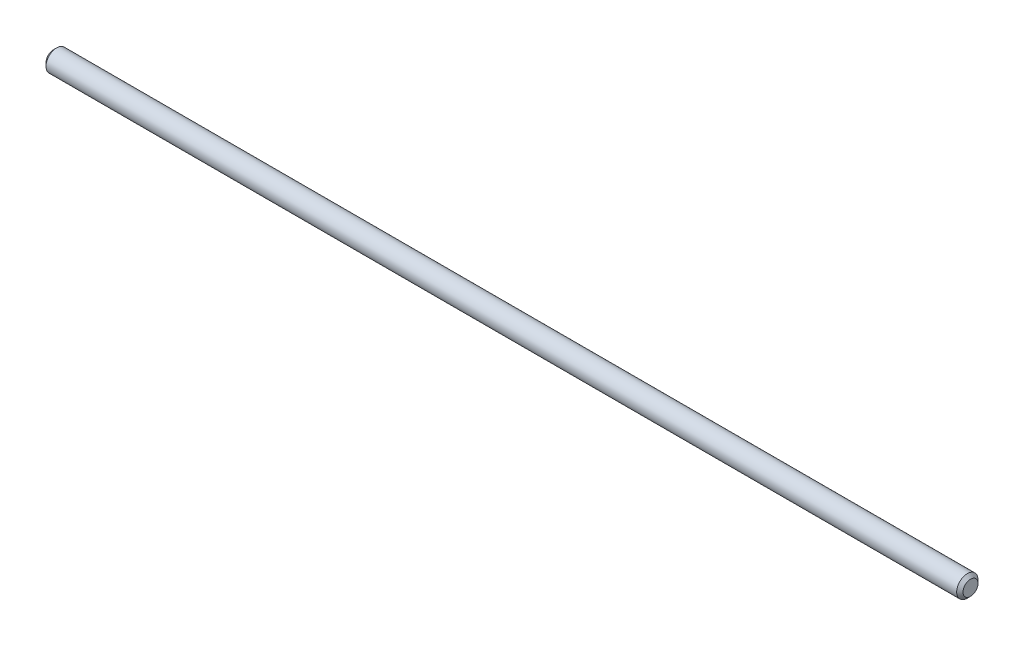
ISO-10303-21;
HEADER;
FILE_DESCRIPTION(('STEP AP214'),'2;1');
FILE_NAME('part.step','',(''),(''),'','','');
FILE_SCHEMA(('AUTOMOTIVE_DESIGN { 1 0 10303 214 1 1 1 1 }'));
ENDSEC;
DATA;
#1=APPLICATION_CONTEXT('core data for automotive mechanical design processes');
#2=APPLICATION_PROTOCOL_DEFINITION('international standard','automotive_design',2000,#1);
#3=PRODUCT_CONTEXT('',#1,'mechanical');
#4=PRODUCT('Part','Part','',(#3));
#5=PRODUCT_RELATED_PRODUCT_CATEGORY('part','',(#4));
#6=PRODUCT_DEFINITION_FORMATION('','',#4);
#7=PRODUCT_DEFINITION_CONTEXT('part definition',#1,'design');
#8=PRODUCT_DEFINITION('design','',#6,#7);
#9=PRODUCT_DEFINITION_SHAPE('','',#8);
#10=(LENGTH_UNIT() NAMED_UNIT(*) SI_UNIT(.MILLI.,.METRE.));
#11=(NAMED_UNIT(*) PLANE_ANGLE_UNIT() SI_UNIT($,.RADIAN.));
#12=(NAMED_UNIT(*) SI_UNIT($,.STERADIAN.) SOLID_ANGLE_UNIT());
#13=UNCERTAINTY_MEASURE_WITH_UNIT(LENGTH_MEASURE(1.E-05),#10,'distance_accuracy_value','');
#14=(GEOMETRIC_REPRESENTATION_CONTEXT(3) GLOBAL_UNCERTAINTY_ASSIGNED_CONTEXT((#13)) GLOBAL_UNIT_ASSIGNED_CONTEXT((#10,
#11,#12)) REPRESENTATION_CONTEXT('',''));
#15=CARTESIAN_POINT('',(0.,0.,0.));
#16=DIRECTION('',(0.,0.,1.));
#17=DIRECTION('',(1.,0.,0.));
#18=AXIS2_PLACEMENT_3D('',#15,#16,#17);
#19=CARTESIAN_POINT('',(-136.525,0.,0.));
#20=DIRECTION('',(1.,0.,0.));
#21=DIRECTION('',(0.,0.,-1.));
#22=AXIS2_PLACEMENT_3D('',#19,#20,#21);
#23=CYLINDRICAL_SURFACE('',#22,3.17499999999995);
#24=CARTESIAN_POINT('',(-135.5725,0.,0.));
#25=DIRECTION('',(1.,0.,0.));
#26=DIRECTION('',(0.,0.,-1.));
#27=AXIS2_PLACEMENT_3D('',#24,#25,#26);
#28=CIRCLE('',#27,3.17499999999995);
#29=CARTESIAN_POINT('',(-135.5725,0.,-3.17499999999995));
#30=VERTEX_POINT('',#29);
#31=EDGE_CURVE('E49',#30,#30,#28,.T.);
#32=CARTESIAN_POINT('',(135.5725,0.,0.));
#33=DIRECTION('',(1.,0.,0.));
#34=DIRECTION('',(0.,0.,-1.));
#35=AXIS2_PLACEMENT_3D('',#32,#33,#34);
#36=CIRCLE('',#35,3.17499999999995);
#37=CARTESIAN_POINT('',(135.5725,0.,-3.17499999999995));
#38=VERTEX_POINT('',#37);
#39=EDGE_CURVE('E53',#38,#38,#36,.F.);
#40=CARTESIAN_POINT('',(-135.5725,0.,-3.17499999999995));
#41=CARTESIAN_POINT('',(-132.748072916667,0.,-3.17499999999995));
#42=CARTESIAN_POINT('',(-129.923645833333,0.,-3.17499999999995));
#43=CARTESIAN_POINT('',(-124.274791666667,0.,-3.17499999999995));
#44=CARTESIAN_POINT('',(-121.450364583333,0.,-3.17499999999995));
#45=CARTESIAN_POINT('',(-115.801510416667,0.,-3.17499999999995));
#46=CARTESIAN_POINT('',(-112.977083333333,0.,-3.17499999999995));
#47=CARTESIAN_POINT('',(-107.328229166667,0.,-3.17499999999995));
#48=CARTESIAN_POINT('',(-104.503802083333,0.,-3.17499999999995));
#49=CARTESIAN_POINT('',(-98.8549479166667,0.,-3.17499999999995));
#50=CARTESIAN_POINT('',(-96.0305208333333,0.,-3.17499999999995));
#51=CARTESIAN_POINT('',(-90.3816666666667,0.,-3.17499999999995));
#52=CARTESIAN_POINT('',(-87.5572395833333,0.,-3.17499999999995));
#53=CARTESIAN_POINT('',(-81.9083854166667,0.,-3.17499999999995));
#54=CARTESIAN_POINT('',(-79.0839583333333,0.,-3.17499999999995));
#55=CARTESIAN_POINT('',(-73.4351041666667,0.,-3.17499999999995));
#56=CARTESIAN_POINT('',(-70.6106770833333,0.,-3.17499999999995));
#57=CARTESIAN_POINT('',(-64.9618229166667,0.,-3.17499999999995));
#58=CARTESIAN_POINT('',(-62.1373958333333,0.,-3.17499999999995));
#59=CARTESIAN_POINT('',(-56.4885416666667,0.,-3.17499999999995));
#60=CARTESIAN_POINT('',(-53.6641145833333,0.,-3.17499999999995));
#61=CARTESIAN_POINT('',(-48.0152604166667,0.,-3.17499999999995));
#62=CARTESIAN_POINT('',(-45.1908333333333,0.,-3.17499999999995));
#63=CARTESIAN_POINT('',(-39.5419791666667,0.,-3.17499999999995));
#64=CARTESIAN_POINT('',(-36.7175520833333,0.,-3.17499999999995));
#65=CARTESIAN_POINT('',(-31.0686979166667,0.,-3.17499999999995));
#66=CARTESIAN_POINT('',(-28.2442708333333,0.,-3.17499999999995));
#67=CARTESIAN_POINT('',(-22.5954166666667,0.,-3.17499999999995));
#68=CARTESIAN_POINT('',(-19.7709895833333,0.,-3.17499999999995));
#69=CARTESIAN_POINT('',(-14.1221354166667,0.,-3.17499999999995));
#70=CARTESIAN_POINT('',(-11.2977083333334,0.,-3.17499999999995));
#71=CARTESIAN_POINT('',(-5.64885416666668,0.,-3.17499999999995));
#72=CARTESIAN_POINT('',(-2.82442708333334,0.,-3.17499999999995));
#73=CARTESIAN_POINT('',(2.82442708333332,0.,-3.17499999999995));
#74=CARTESIAN_POINT('',(5.64885416666664,0.,-3.17499999999995));
#75=CARTESIAN_POINT('',(11.2977083333333,0.,-3.17499999999995));
#76=CARTESIAN_POINT('',(14.1221354166666,0.,-3.17499999999995));
#77=CARTESIAN_POINT('',(19.7709895833333,0.,-3.17499999999995));
#78=CARTESIAN_POINT('',(22.5954166666667,0.,-3.17499999999995));
#79=CARTESIAN_POINT('',(28.2442708333333,0.,-3.17499999999995));
#80=CARTESIAN_POINT('',(31.0686979166666,0.,-3.17499999999995));
#81=CARTESIAN_POINT('',(36.7175520833333,0.,-3.17499999999995));
#82=CARTESIAN_POINT('',(39.5419791666666,0.,-3.17499999999995));
#83=CARTESIAN_POINT('',(45.1908333333333,0.,-3.17499999999995));
#84=CARTESIAN_POINT('',(48.0152604166667,0.,-3.17499999999995));
#85=CARTESIAN_POINT('',(53.6641145833333,0.,-3.17499999999995));
#86=CARTESIAN_POINT('',(56.4885416666666,0.,-3.17499999999995));
#87=CARTESIAN_POINT('',(62.1373958333333,0.,-3.17499999999995));
#88=CARTESIAN_POINT('',(64.9618229166666,0.,-3.17499999999995));
#89=CARTESIAN_POINT('',(70.6106770833333,0.,-3.17499999999995));
#90=CARTESIAN_POINT('',(73.4351041666666,0.,-3.17499999999995));
#91=CARTESIAN_POINT('',(79.0839583333333,0.,-3.17499999999995));
#92=CARTESIAN_POINT('',(81.9083854166666,0.,-3.17499999999995));
#93=CARTESIAN_POINT('',(87.5572395833333,0.,-3.17499999999995));
#94=CARTESIAN_POINT('',(90.3816666666666,0.,-3.17499999999995));
#95=CARTESIAN_POINT('',(96.0305208333333,0.,-3.17499999999995));
#96=CARTESIAN_POINT('',(98.8549479166666,0.,-3.17499999999995));
#97=CARTESIAN_POINT('',(104.503802083333,0.,-3.17499999999995));
#98=CARTESIAN_POINT('',(107.328229166667,0.,-3.17499999999995));
#99=CARTESIAN_POINT('',(112.977083333333,0.,-3.17499999999995));
#100=CARTESIAN_POINT('',(115.801510416667,0.,-3.17499999999995));
#101=CARTESIAN_POINT('',(121.450364583333,0.,-3.17499999999995));
#102=CARTESIAN_POINT('',(124.274791666667,0.,-3.17499999999995));
#103=CARTESIAN_POINT('',(129.923645833333,0.,-3.17499999999995));
#104=CARTESIAN_POINT('',(132.748072916667,0.,-3.17499999999995));
#105=CARTESIAN_POINT('',(135.5725,0.,-3.17499999999995));
#106=B_SPLINE_CURVE_WITH_KNOTS('',3,(#40,#41,#42,#43,#44,#45,#46,#47,#48,#49,#50,#51,#52,#53,
#54,#55,#56,#57,#58,#59,#60,#61,#62,#63,#64,#65,#66,#67,#68,#69,#70,#71,#72,#73,#74,#75,#76,#77,
#78,#79,#80,#81,#82,#83,#84,#85,#86,#87,#88,#89,#90,#91,#92,#93,#94,#95,#96,#97,#98,#99,#100,
#101,#102,#103,#104,#105),.UNSPECIFIED.,.F.,.F.,(4,2,2,2,2,2,2,2,2,2,2,2,2,2,2,2,2,2,2,2,2,2,2,
2,2,2,2,2,2,2,2,2,4),(0.,8.47328124999999,16.9465625,25.41984375,33.893125,42.36640625,
50.8396875,59.31296875,67.78625,76.25953125,84.7328125,93.20609375,101.679375,110.15265625,
118.6259375,127.09921875,135.5725,144.04578125,152.5190625,160.99234375,169.465625,177.93890625,
186.4121875,194.88546875,203.35875,211.83203125,220.3053125,228.77859375,237.251875,
245.72515625,254.1984375,262.67171875,271.145),.UNSPECIFIED.);
#107=EDGE_CURVE('BSEAM38',#30,#38,#106,.T.);
#108=ORIENTED_EDGE('',*,*,#31,.T.);
#109=ORIENTED_EDGE('',*,*,#39,.T.);
#110=ORIENTED_EDGE('',*,*,#107,.T.);
#111=ORIENTED_EDGE('',*,*,#107,.F.);
#112=EDGE_LOOP('',(#108,#110,#109,#111));
#113=FACE_BOUND('',#112,.T.);
#114=ADVANCED_FACE('F38',(#113),#23,.T.);
#115=CARTESIAN_POINT('',(-136.525,0.,0.));
#116=DIRECTION('',(1.,0.,0.));
#117=DIRECTION('',(0.,0.,-1.));
#118=AXIS2_PLACEMENT_3D('',#115,#116,#117);
#119=PLANE('',#118);
#120=CARTESIAN_POINT('',(-136.525,0.,0.));
#121=DIRECTION('',(1.,0.,0.));
#122=DIRECTION('',(0.,0.,-1.));
#123=AXIS2_PLACEMENT_3D('',#120,#121,#122);
#124=CIRCLE('',#123,2.22249999999993);
#125=CARTESIAN_POINT('',(-136.525,0.,-2.22249999999992));
#126=VERTEX_POINT('',#125);
#127=EDGE_CURVE('E45',#126,#126,#124,.F.);
#128=ORIENTED_EDGE('',*,*,#127,.T.);
#129=EDGE_LOOP('',(#128));
#130=FACE_BOUND('',#129,.T.);
#131=ADVANCED_FACE('F69',(#130),#119,.F.);
#132=CARTESIAN_POINT('',(136.525,0.,0.));
#133=DIRECTION('',(1.,0.,0.));
#134=DIRECTION('',(0.,0.,-1.));
#135=AXIS2_PLACEMENT_3D('',#132,#133,#134);
#136=PLANE('',#135);
#137=CARTESIAN_POINT('',(136.525,0.,0.));
#138=DIRECTION('',(1.,0.,0.));
#139=DIRECTION('',(0.,0.,-1.));
#140=AXIS2_PLACEMENT_3D('',#137,#138,#139);
#141=CIRCLE('',#140,2.22249999999996);
#142=CARTESIAN_POINT('',(136.525,0.,-2.22249999999996));
#143=VERTEX_POINT('',#142);
#144=EDGE_CURVE('E10',#143,#143,#141,.T.);
#145=ORIENTED_EDGE('',*,*,#144,.T.);
#146=EDGE_LOOP('',(#145));
#147=FACE_BOUND('',#146,.T.);
#148=ADVANCED_FACE('F66',(#147),#136,.T.);
#149=CARTESIAN_POINT('',(-135.5725,0.,0.));
#150=DIRECTION('',(1.,0.,0.));
#151=DIRECTION('',(0.,0.,-1.));
#152=AXIS2_PLACEMENT_3D('',#149,#150,#151);
#153=CONICAL_SURFACE('',#152,3.17499999999995,0.785398163397447);
#154=CARTESIAN_POINT('',(-136.525,0.,-2.22249999999992));
#155=CARTESIAN_POINT('',(-136.515078125,0.,-2.23242187499992));
#156=CARTESIAN_POINT('',(-136.50515625,0.,-2.24234374999992));
#157=CARTESIAN_POINT('',(-136.4853125,0.,-2.26218749999992));
#158=CARTESIAN_POINT('',(-136.475390625,0.,-2.27210937499992));
#159=CARTESIAN_POINT('',(-136.455546875,0.,-2.29195312499992));
#160=CARTESIAN_POINT('',(-136.445625,0.,-2.30187499999992));
#161=CARTESIAN_POINT('',(-136.42578125,0.,-2.32171874999992));
#162=CARTESIAN_POINT('',(-136.415859375,0.,-2.33164062499992));
#163=CARTESIAN_POINT('',(-136.396015625,0.,-2.35148437499992));
#164=CARTESIAN_POINT('',(-136.38609375,0.,-2.36140624999992));
#165=CARTESIAN_POINT('',(-136.36625,0.,-2.38124999999992));
#166=CARTESIAN_POINT('',(-136.356328125,0.,-2.39117187499992));
#167=CARTESIAN_POINT('',(-136.336484375,0.,-2.41101562499992));
#168=CARTESIAN_POINT('',(-136.3265625,0.,-2.42093749999992));
#169=CARTESIAN_POINT('',(-136.30671875,0.,-2.44078124999992));
#170=CARTESIAN_POINT('',(-136.296796875,0.,-2.45070312499992));
#171=CARTESIAN_POINT('',(-136.276953125,0.,-2.47054687499993));
#172=CARTESIAN_POINT('',(-136.26703125,0.,-2.48046874999993));
#173=CARTESIAN_POINT('',(-136.2471875,0.,-2.50031249999992));
#174=CARTESIAN_POINT('',(-136.237265625,0.,-2.51023437499992));
#175=CARTESIAN_POINT('',(-136.217421875,0.,-2.53007812499992));
#176=CARTESIAN_POINT('',(-136.2075,0.,-2.53999999999993));
#177=CARTESIAN_POINT('',(-136.18765625,0.,-2.55984374999993));
#178=CARTESIAN_POINT('',(-136.177734375,0.,-2.56976562499993));
#179=CARTESIAN_POINT('',(-136.157890625,0.,-2.58960937499993));
#180=CARTESIAN_POINT('',(-136.14796875,0.,-2.59953124999992));
#181=CARTESIAN_POINT('',(-136.128125,0.,-2.61937499999993));
#182=CARTESIAN_POINT('',(-136.118203125,0.,-2.62929687499993));
#183=CARTESIAN_POINT('',(-136.098359375,0.,-2.64914062499993));
#184=CARTESIAN_POINT('',(-136.0884375,0.,-2.65906249999993));
#185=CARTESIAN_POINT('',(-136.06859375,0.,-2.67890624999993));
#186=CARTESIAN_POINT('',(-136.058671875,0.,-2.68882812499993));
#187=CARTESIAN_POINT('',(-136.038828125,0.,-2.70867187499993));
#188=CARTESIAN_POINT('',(-136.02890625,0.,-2.71859374999993));
#189=CARTESIAN_POINT('',(-136.0090625,0.,-2.73843749999993));
#190=CARTESIAN_POINT('',(-135.999140625,0.,-2.74835937499993));
#191=CARTESIAN_POINT('',(-135.979296875,0.,-2.76820312499993));
#192=CARTESIAN_POINT('',(-135.969375,0.,-2.77812499999993));
#193=CARTESIAN_POINT('',(-135.94953125,0.,-2.79796874999993));
#194=CARTESIAN_POINT('',(-135.939609375,0.,-2.80789062499993));
#195=CARTESIAN_POINT('',(-135.919765625,0.,-2.82773437499993));
#196=CARTESIAN_POINT('',(-135.90984375,0.,-2.83765624999993));
#197=CARTESIAN_POINT('',(-135.89,0.,-2.85749999999993));
#198=CARTESIAN_POINT('',(-135.880078125,0.,-2.86742187499993));
#199=CARTESIAN_POINT('',(-135.860234375,0.,-2.88726562499994));
#200=CARTESIAN_POINT('',(-135.8503125,0.,-2.89718749999993));
#201=CARTESIAN_POINT('',(-135.83046875,0.,-2.91703124999993));
#202=CARTESIAN_POINT('',(-135.820546875,0.,-2.92695312499993));
#203=CARTESIAN_POINT('',(-135.800703125,0.,-2.94679687499993));
#204=CARTESIAN_POINT('',(-135.79078125,0.,-2.95671874999994));
#205=CARTESIAN_POINT('',(-135.7709375,0.,-2.97656249999994));
#206=CARTESIAN_POINT('',(-135.761015625,0.,-2.98648437499993));
#207=CARTESIAN_POINT('',(-135.741171875,0.,-3.00632812499993));
#208=CARTESIAN_POINT('',(-135.73125,0.,-3.01624999999994));
#209=CARTESIAN_POINT('',(-135.71140625,0.,-3.03609374999994));
#210=CARTESIAN_POINT('',(-135.701484375,0.,-3.04601562499994));
#211=CARTESIAN_POINT('',(-135.681640625,0.,-3.06585937499994));
#212=CARTESIAN_POINT('',(-135.67171875,0.,-3.07578124999993));
#213=CARTESIAN_POINT('',(-135.651875,0.,-3.09562499999994));
#214=CARTESIAN_POINT('',(-135.641953125,0.,-3.10554687499994));
#215=CARTESIAN_POINT('',(-135.622109375,0.,-3.12539062499994));
#216=CARTESIAN_POINT('',(-135.6121875,0.,-3.13531249999994));
#217=CARTESIAN_POINT('',(-135.59234375,0.,-3.15515624999994));
#218=CARTESIAN_POINT('',(-135.582421875,0.,-3.16507812499994));
#219=CARTESIAN_POINT('',(-135.5725,0.,-3.17499999999994));
#220=B_SPLINE_CURVE_WITH_KNOTS('',3,(#154,#155,#156,#157,#158,#159,#160,#161,#162,#163,#164,
#165,#166,#167,#168,#169,#170,#171,#172,#173,#174,#175,#176,#177,#178,#179,#180,#181,#182,#183,
#184,#185,#186,#187,#188,#189,#190,#191,#192,#193,#194,#195,#196,#197,#198,#199,#200,#201,#202,
#203,#204,#205,#206,#207,#208,#209,#210,#211,#212,#213,#214,#215,#216,#217,#218,#219),
.UNSPECIFIED.,.F.,.F.,(4,2,2,2,2,2,2,2,2,2,2,2,2,2,2,2,2,2,2,2,2,2,2,2,2,2,2,2,2,2,2,2,4),(0.,
0.04209495056752,0.0841899011350397,0.12628485170254,0.16837980227006,0.21047475283758,
0.25256970340508,0.2946646539726,0.336759604540101,0.378854555107621,0.420949505675141,
0.463044456242641,0.505139406810161,0.547234357377681,0.589329307945181,0.631424258512701,
0.673519209080201,0.715614159647721,0.757709110215241,0.799804060782741,0.841899011350261,
0.883993961917781,0.926088912485282,0.968183863052802,1.01027881362032,1.05237376418782,
1.09446871475534,1.13656366532284,1.17865861589036,1.22075356645788,1.26284851702538,
1.3049434675929,1.34703841816042),.UNSPECIFIED.);
#221=EDGE_CURVE('BSEAM62',#126,#30,#220,.T.);
#222=ORIENTED_EDGE('',*,*,#127,.F.);
#223=ORIENTED_EDGE('',*,*,#31,.F.);
#224=ORIENTED_EDGE('',*,*,#221,.T.);
#225=ORIENTED_EDGE('',*,*,#221,.F.);
#226=EDGE_LOOP('',(#222,#224,#223,#225));
#227=FACE_BOUND('',#226,.T.);
#228=ADVANCED_FACE('F62',(#227),#153,.T.);
#229=CARTESIAN_POINT('',(136.525,0.,0.));
#230=DIRECTION('',(-1.,0.,0.));
#231=DIRECTION('',(0.,0.,1.));
#232=AXIS2_PLACEMENT_3D('',#229,#230,#231);
#233=CONICAL_SURFACE('',#232,2.22249999999996,0.785398163397432);
#234=ORIENTED_EDGE('',*,*,#39,.F.);
#235=EDGE_LOOP('',(#234));
#236=FACE_BOUND('',#235,.T.);
#237=ORIENTED_EDGE('',*,*,#144,.F.);
#238=EDGE_LOOP('',(#237));
#239=FACE_BOUND('',#238,.T.);
#240=ADVANCED_FACE('F40',(#236,#239),#233,.T.);
#241=CLOSED_SHELL('',(#114,#131,#148,#228,#240));
#242=MANIFOLD_SOLID_BREP('B2',#241);
#243=ADVANCED_BREP_SHAPE_REPRESENTATION('',(#18,#242),#14);
#244=SHAPE_DEFINITION_REPRESENTATION(#9,#243);
ENDSEC;
END-ISO-10303-21;
